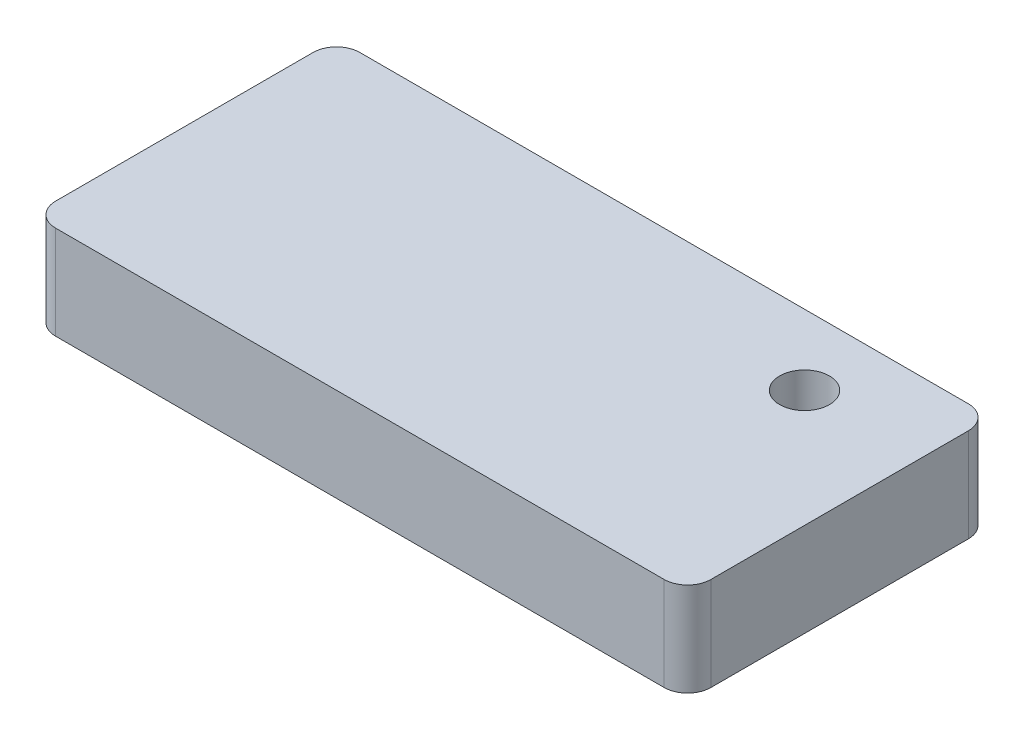
ISO-10303-21;
HEADER;
FILE_DESCRIPTION(('STEP AP214'),'2;1');
FILE_NAME('part.step','',(''),(''),'','','');
FILE_SCHEMA(('AUTOMOTIVE_DESIGN { 1 0 10303 214 1 1 1 1 }'));
ENDSEC;
DATA;
#1=APPLICATION_CONTEXT('core data for automotive mechanical design processes');
#2=APPLICATION_PROTOCOL_DEFINITION('international standard','automotive_design',2000,#1);
#3=PRODUCT_CONTEXT('',#1,'mechanical');
#4=PRODUCT('Part','Part','',(#3));
#5=PRODUCT_RELATED_PRODUCT_CATEGORY('part','',(#4));
#6=PRODUCT_DEFINITION_FORMATION('','',#4);
#7=PRODUCT_DEFINITION_CONTEXT('part definition',#1,'design');
#8=PRODUCT_DEFINITION('design','',#6,#7);
#9=PRODUCT_DEFINITION_SHAPE('','',#8);
#10=(LENGTH_UNIT() NAMED_UNIT(*) SI_UNIT(.MILLI.,.METRE.));
#11=(NAMED_UNIT(*) PLANE_ANGLE_UNIT() SI_UNIT($,.RADIAN.));
#12=(NAMED_UNIT(*) SI_UNIT($,.STERADIAN.) SOLID_ANGLE_UNIT());
#13=UNCERTAINTY_MEASURE_WITH_UNIT(LENGTH_MEASURE(1.E-05),#10,'distance_accuracy_value','');
#14=(GEOMETRIC_REPRESENTATION_CONTEXT(3) GLOBAL_UNCERTAINTY_ASSIGNED_CONTEXT((#13)) GLOBAL_UNIT_ASSIGNED_CONTEXT((#10,
#11,#12)) REPRESENTATION_CONTEXT('',''));
#15=CARTESIAN_POINT('',(0.,0.,0.));
#16=DIRECTION('',(0.,0.,1.));
#17=DIRECTION('',(1.,0.,0.));
#18=AXIS2_PLACEMENT_3D('',#15,#16,#17);
#19=CARTESIAN_POINT('',(0.,12.7,0.));
#20=DIRECTION('',(1.,0.,0.));
#21=DIRECTION('',(0.,0.,-1.));
#22=AXIS2_PLACEMENT_3D('',#19,#20,#21);
#23=PLANE('',#22);
#24=DIRECTION('',(0.,0.,1.));
#25=VECTOR('',#24,1.);
#26=CARTESIAN_POINT('',(0.,12.7,0.));
#27=LINE('',#26,#25);
#28=CARTESIAN_POINT('',(0.,12.7,-38.1));
#29=VERTEX_POINT('',#28);
#30=CARTESIAN_POINT('',(0.,12.7,-3.175));
#31=VERTEX_POINT('',#30);
#32=EDGE_CURVE('E128',#29,#31,#27,.T.);
#33=ORIENTED_EDGE('',*,*,#32,.F.);
#34=DIRECTION('',(0.,-1.,0.));
#35=VECTOR('',#34,1.);
#36=CARTESIAN_POINT('',(0.,12.7,-38.1));
#37=LINE('',#36,#35);
#38=CARTESIAN_POINT('',(0.,0.,-38.1));
#39=VERTEX_POINT('',#38);
#40=EDGE_CURVE('E11',#29,#39,#37,.T.);
#41=ORIENTED_EDGE('',*,*,#40,.T.);
#42=DIRECTION('',(0.,0.,1.));
#43=VECTOR('',#42,1.);
#44=CARTESIAN_POINT('',(0.,0.,0.));
#45=LINE('',#44,#43);
#46=CARTESIAN_POINT('',(0.,0.,-3.175));
#47=VERTEX_POINT('',#46);
#48=EDGE_CURVE('E130',#39,#47,#45,.T.);
#49=ORIENTED_EDGE('',*,*,#48,.T.);
#50=DIRECTION('',(0.,-1.,0.));
#51=VECTOR('',#50,1.);
#52=CARTESIAN_POINT('',(0.,12.7,-3.175));
#53=LINE('',#52,#51);
#54=EDGE_CURVE('E41',#47,#31,#53,.F.);
#55=ORIENTED_EDGE('',*,*,#54,.T.);
#56=EDGE_LOOP('',(#33,#41,#49,#55));
#57=FACE_BOUND('',#56,.T.);
#58=ADVANCED_FACE('F33',(#57),#23,.F.);
#59=CARTESIAN_POINT('',(0.,12.7,0.));
#60=DIRECTION('',(0.,0.,-1.));
#61=DIRECTION('',(-1.,0.,0.));
#62=AXIS2_PLACEMENT_3D('',#59,#60,#61);
#63=PLANE('',#62);
#64=DIRECTION('',(1.,0.,0.));
#65=VECTOR('',#64,1.);
#66=CARTESIAN_POINT('',(0.,0.,0.));
#67=LINE('',#66,#65);
#68=CARTESIAN_POINT('',(3.175,0.,0.));
#69=VERTEX_POINT('',#68);
#70=CARTESIAN_POINT('',(85.725,0.,0.));
#71=VERTEX_POINT('',#70);
#72=EDGE_CURVE('E126',#69,#71,#67,.T.);
#73=ORIENTED_EDGE('',*,*,#72,.T.);
#74=DIRECTION('',(0.,-1.,0.));
#75=VECTOR('',#74,1.);
#76=CARTESIAN_POINT('',(85.725,12.7,0.));
#77=LINE('',#76,#75);
#78=CARTESIAN_POINT('',(85.725,12.7,0.));
#79=VERTEX_POINT('',#78);
#80=EDGE_CURVE('E105',#71,#79,#77,.F.);
#81=ORIENTED_EDGE('',*,*,#80,.T.);
#82=DIRECTION('',(1.,0.,0.));
#83=VECTOR('',#82,1.);
#84=CARTESIAN_POINT('',(0.,12.7,0.));
#85=LINE('',#84,#83);
#86=CARTESIAN_POINT('',(3.175,12.7,0.));
#87=VERTEX_POINT('',#86);
#88=EDGE_CURVE('E166',#87,#79,#85,.T.);
#89=ORIENTED_EDGE('',*,*,#88,.F.);
#90=DIRECTION('',(0.,-1.,0.));
#91=VECTOR('',#90,1.);
#92=CARTESIAN_POINT('',(3.175,12.7,0.));
#93=LINE('',#92,#91);
#94=EDGE_CURVE('E110',#87,#69,#93,.T.);
#95=ORIENTED_EDGE('',*,*,#94,.T.);
#96=EDGE_LOOP('',(#73,#81,#89,#95));
#97=FACE_BOUND('',#96,.T.);
#98=ADVANCED_FACE('F170',(#97),#63,.F.);
#99=CARTESIAN_POINT('',(88.9,12.7,0.));
#100=DIRECTION('',(-1.,0.,0.));
#101=DIRECTION('',(0.,0.,1.));
#102=AXIS2_PLACEMENT_3D('',#99,#100,#101);
#103=PLANE('',#102);
#104=DIRECTION('',(0.,0.,-1.));
#105=VECTOR('',#104,1.);
#106=CARTESIAN_POINT('',(88.9,12.7,0.));
#107=LINE('',#106,#105);
#108=CARTESIAN_POINT('',(88.9,12.7,-3.175));
#109=VERTEX_POINT('',#108);
#110=CARTESIAN_POINT('',(88.9,12.7,-38.1));
#111=VERTEX_POINT('',#110);
#112=EDGE_CURVE('E119',#109,#111,#107,.T.);
#113=ORIENTED_EDGE('',*,*,#112,.F.);
#114=DIRECTION('',(0.,-1.,0.));
#115=VECTOR('',#114,1.);
#116=CARTESIAN_POINT('',(88.9,12.7,-3.175));
#117=LINE('',#116,#115);
#118=CARTESIAN_POINT('',(88.9,0.,-3.175));
#119=VERTEX_POINT('',#118);
#120=EDGE_CURVE('E104',#109,#119,#117,.T.);
#121=ORIENTED_EDGE('',*,*,#120,.T.);
#122=DIRECTION('',(0.,0.,-1.));
#123=VECTOR('',#122,1.);
#124=CARTESIAN_POINT('',(88.9,0.,0.));
#125=LINE('',#124,#123);
#126=CARTESIAN_POINT('',(88.9,0.,-38.1));
#127=VERTEX_POINT('',#126);
#128=EDGE_CURVE('E117',#119,#127,#125,.T.);
#129=ORIENTED_EDGE('',*,*,#128,.T.);
#130=DIRECTION('',(0.,-1.,0.));
#131=VECTOR('',#130,1.);
#132=CARTESIAN_POINT('',(88.9,12.7,-38.1));
#133=LINE('',#132,#131);
#134=EDGE_CURVE('E121',#127,#111,#133,.F.);
#135=ORIENTED_EDGE('',*,*,#134,.T.);
#136=EDGE_LOOP('',(#113,#121,#129,#135));
#137=FACE_BOUND('',#136,.T.);
#138=ADVANCED_FACE('F116',(#137),#103,.F.);
#139=CARTESIAN_POINT('',(0.,12.7,-41.275));
#140=DIRECTION('',(0.,0.,1.));
#141=DIRECTION('',(1.,0.,0.));
#142=AXIS2_PLACEMENT_3D('',#139,#140,#141);
#143=PLANE('',#142);
#144=DIRECTION('',(-1.,0.,0.));
#145=VECTOR('',#144,1.);
#146=CARTESIAN_POINT('',(0.,12.7,-41.275));
#147=LINE('',#146,#145);
#148=CARTESIAN_POINT('',(85.725,12.7,-41.275));
#149=VERTEX_POINT('',#148);
#150=CARTESIAN_POINT('',(3.175,12.7,-41.275));
#151=VERTEX_POINT('',#150);
#152=EDGE_CURVE('E134',#149,#151,#147,.T.);
#153=ORIENTED_EDGE('',*,*,#152,.F.);
#154=DIRECTION('',(0.,-1.,0.));
#155=VECTOR('',#154,1.);
#156=CARTESIAN_POINT('',(85.725,12.7,-41.275));
#157=LINE('',#156,#155);
#158=CARTESIAN_POINT('',(85.725,0.,-41.275));
#159=VERTEX_POINT('',#158);
#160=EDGE_CURVE('E151',#149,#159,#157,.T.);
#161=ORIENTED_EDGE('',*,*,#160,.T.);
#162=DIRECTION('',(-1.,0.,0.));
#163=VECTOR('',#162,1.);
#164=CARTESIAN_POINT('',(0.,0.,-41.275));
#165=LINE('',#164,#163);
#166=CARTESIAN_POINT('',(3.175,0.,-41.275));
#167=VERTEX_POINT('',#166);
#168=EDGE_CURVE('E125',#159,#167,#165,.T.);
#169=ORIENTED_EDGE('',*,*,#168,.T.);
#170=DIRECTION('',(0.,-1.,0.));
#171=VECTOR('',#170,1.);
#172=CARTESIAN_POINT('',(3.175,12.7,-41.275));
#173=LINE('',#172,#171);
#174=EDGE_CURVE('E48',#167,#151,#173,.F.);
#175=ORIENTED_EDGE('',*,*,#174,.T.);
#176=EDGE_LOOP('',(#153,#161,#169,#175));
#177=FACE_BOUND('',#176,.T.);
#178=ADVANCED_FACE('F185',(#177),#143,.F.);
#179=CARTESIAN_POINT('',(0.,12.7,0.));
#180=DIRECTION('',(0.,-1.,0.));
#181=DIRECTION('',(0.,0.,-1.));
#182=AXIS2_PLACEMENT_3D('',#179,#180,#181);
#183=PLANE('',#182);
#184=CARTESIAN_POINT('',(73.025,12.7,-31.75));
#185=DIRECTION('',(0.,1.,0.));
#186=DIRECTION('',(0.,0.,1.));
#187=AXIS2_PLACEMENT_3D('',#184,#185,#186);
#188=CIRCLE('',#187,3.37819999999998);
#189=CARTESIAN_POINT('',(73.025,12.7,-28.3718));
#190=VERTEX_POINT('',#189);
#191=EDGE_CURVE('E173',#190,#190,#188,.T.);
#192=ORIENTED_EDGE('',*,*,#191,.F.);
#193=EDGE_LOOP('',(#192));
#194=FACE_BOUND('',#193,.T.);
#195=ORIENTED_EDGE('',*,*,#88,.T.);
#196=CARTESIAN_POINT('',(85.725,12.7,-3.175));
#197=DIRECTION('',(0.,-1.,0.));
#198=DIRECTION('',(0.,0.,-1.));
#199=AXIS2_PLACEMENT_3D('',#196,#197,#198);
#200=CIRCLE('',#199,3.175);
#201=EDGE_CURVE('E148',#79,#109,#200,.F.);
#202=ORIENTED_EDGE('',*,*,#201,.T.);
#203=ORIENTED_EDGE('',*,*,#112,.T.);
#204=CARTESIAN_POINT('',(85.725,12.7,-38.1));
#205=DIRECTION('',(0.,-1.,0.));
#206=DIRECTION('',(0.,0.,-1.));
#207=AXIS2_PLACEMENT_3D('',#204,#205,#206);
#208=CIRCLE('',#207,3.175);
#209=EDGE_CURVE('E55',#111,#149,#208,.F.);
#210=ORIENTED_EDGE('',*,*,#209,.T.);
#211=ORIENTED_EDGE('',*,*,#152,.T.);
#212=CARTESIAN_POINT('',(3.175,12.7,-38.1));
#213=DIRECTION('',(0.,-1.,0.));
#214=DIRECTION('',(0.,0.,-1.));
#215=AXIS2_PLACEMENT_3D('',#212,#213,#214);
#216=CIRCLE('',#215,3.175);
#217=EDGE_CURVE('E145',#151,#29,#216,.F.);
#218=ORIENTED_EDGE('',*,*,#217,.T.);
#219=ORIENTED_EDGE('',*,*,#32,.T.);
#220=CARTESIAN_POINT('',(3.175,12.7,-3.175));
#221=DIRECTION('',(0.,-1.,0.));
#222=DIRECTION('',(0.,0.,-1.));
#223=AXIS2_PLACEMENT_3D('',#220,#221,#222);
#224=CIRCLE('',#223,3.175);
#225=EDGE_CURVE('E143',#31,#87,#224,.F.);
#226=ORIENTED_EDGE('',*,*,#225,.T.);
#227=EDGE_LOOP('',(#195,#202,#203,#210,#211,#218,#219,#226));
#228=FACE_BOUND('',#227,.T.);
#229=ADVANCED_FACE('F163',(#194,#228),#183,.F.);
#230=CARTESIAN_POINT('',(0.,0.,0.));
#231=DIRECTION('',(0.,-1.,0.));
#232=DIRECTION('',(0.,0.,-1.));
#233=AXIS2_PLACEMENT_3D('',#230,#231,#232);
#234=PLANE('',#233);
#235=CARTESIAN_POINT('',(73.025,0.,-31.75));
#236=DIRECTION('',(0.,1.,0.));
#237=DIRECTION('',(0.,0.,1.));
#238=AXIS2_PLACEMENT_3D('',#235,#236,#237);
#239=CIRCLE('',#238,3.3782);
#240=CARTESIAN_POINT('',(73.025,0.,-28.3718));
#241=VERTEX_POINT('',#240);
#242=EDGE_CURVE('E171',#241,#241,#239,.T.);
#243=ORIENTED_EDGE('',*,*,#242,.T.);
#244=EDGE_LOOP('',(#243));
#245=FACE_BOUND('',#244,.T.);
#246=ORIENTED_EDGE('',*,*,#128,.F.);
#247=CARTESIAN_POINT('',(85.725,0.,-3.175));
#248=DIRECTION('',(0.,-1.,0.));
#249=DIRECTION('',(0.,0.,-1.));
#250=AXIS2_PLACEMENT_3D('',#247,#248,#249);
#251=CIRCLE('',#250,3.175);
#252=EDGE_CURVE('E100',#119,#71,#251,.T.);
#253=ORIENTED_EDGE('',*,*,#252,.T.);
#254=ORIENTED_EDGE('',*,*,#72,.F.);
#255=CARTESIAN_POINT('',(3.175,0.,-3.175));
#256=DIRECTION('',(0.,-1.,0.));
#257=DIRECTION('',(0.,0.,-1.));
#258=AXIS2_PLACEMENT_3D('',#255,#256,#257);
#259=CIRCLE('',#258,3.175);
#260=EDGE_CURVE('E120',#69,#47,#259,.T.);
#261=ORIENTED_EDGE('',*,*,#260,.T.);
#262=ORIENTED_EDGE('',*,*,#48,.F.);
#263=CARTESIAN_POINT('',(3.175,0.,-38.1));
#264=DIRECTION('',(0.,-1.,0.));
#265=DIRECTION('',(0.,0.,-1.));
#266=AXIS2_PLACEMENT_3D('',#263,#264,#265);
#267=CIRCLE('',#266,3.175);
#268=EDGE_CURVE('E137',#39,#167,#267,.T.);
#269=ORIENTED_EDGE('',*,*,#268,.T.);
#270=ORIENTED_EDGE('',*,*,#168,.F.);
#271=CARTESIAN_POINT('',(85.725,0.,-38.1));
#272=DIRECTION('',(0.,-1.,0.));
#273=DIRECTION('',(0.,0.,-1.));
#274=AXIS2_PLACEMENT_3D('',#271,#272,#273);
#275=CIRCLE('',#274,3.175);
#276=EDGE_CURVE('E111',#159,#127,#275,.T.);
#277=ORIENTED_EDGE('',*,*,#276,.T.);
#278=EDGE_LOOP('',(#246,#253,#254,#261,#262,#269,#270,#277));
#279=FACE_BOUND('',#278,.T.);
#280=ADVANCED_FACE('F123',(#245,#279),#234,.T.);
#281=CARTESIAN_POINT('',(73.025,12.7,-31.75));
#282=DIRECTION('',(0.,1.,0.));
#283=DIRECTION('',(0.,0.,1.));
#284=AXIS2_PLACEMENT_3D('',#281,#282,#283);
#285=CYLINDRICAL_SURFACE('',#284,3.37819999999999);
#286=ORIENTED_EDGE('',*,*,#242,.F.);
#287=EDGE_LOOP('',(#286));
#288=FACE_BOUND('',#287,.T.);
#289=ORIENTED_EDGE('',*,*,#191,.T.);
#290=EDGE_LOOP('',(#289));
#291=FACE_BOUND('',#290,.T.);
#292=ADVANCED_FACE('F182',(#288,#291),#285,.F.);
#293=CARTESIAN_POINT('',(85.725,12.7,-3.175));
#294=DIRECTION('',(0.,-1.,0.));
#295=DIRECTION('',(0.,0.,-1.));
#296=AXIS2_PLACEMENT_3D('',#293,#294,#295);
#297=CYLINDRICAL_SURFACE('',#296,3.175);
#298=ORIENTED_EDGE('',*,*,#201,.F.);
#299=ORIENTED_EDGE('',*,*,#80,.F.);
#300=ORIENTED_EDGE('',*,*,#252,.F.);
#301=ORIENTED_EDGE('',*,*,#120,.F.);
#302=EDGE_LOOP('',(#298,#299,#300,#301));
#303=FACE_BOUND('',#302,.T.);
#304=ADVANCED_FACE('F103',(#303),#297,.T.);
#305=CARTESIAN_POINT('',(85.725,12.7,-38.1));
#306=DIRECTION('',(0.,-1.,0.));
#307=DIRECTION('',(0.,0.,-1.));
#308=AXIS2_PLACEMENT_3D('',#305,#306,#307);
#309=CYLINDRICAL_SURFACE('',#308,3.175);
#310=ORIENTED_EDGE('',*,*,#209,.F.);
#311=ORIENTED_EDGE('',*,*,#134,.F.);
#312=ORIENTED_EDGE('',*,*,#276,.F.);
#313=ORIENTED_EDGE('',*,*,#160,.F.);
#314=EDGE_LOOP('',(#310,#311,#312,#313));
#315=FACE_BOUND('',#314,.T.);
#316=ADVANCED_FACE('F206',(#315),#309,.T.);
#317=CARTESIAN_POINT('',(3.175,12.7,-38.1));
#318=DIRECTION('',(0.,-1.,0.));
#319=DIRECTION('',(0.,0.,-1.));
#320=AXIS2_PLACEMENT_3D('',#317,#318,#319);
#321=CYLINDRICAL_SURFACE('',#320,3.175);
#322=ORIENTED_EDGE('',*,*,#217,.F.);
#323=ORIENTED_EDGE('',*,*,#174,.F.);
#324=ORIENTED_EDGE('',*,*,#268,.F.);
#325=ORIENTED_EDGE('',*,*,#40,.F.);
#326=EDGE_LOOP('',(#322,#323,#324,#325));
#327=FACE_BOUND('',#326,.T.);
#328=ADVANCED_FACE('F208',(#327),#321,.T.);
#329=CARTESIAN_POINT('',(3.175,12.7,-3.175));
#330=DIRECTION('',(0.,-1.,0.));
#331=DIRECTION('',(0.,0.,-1.));
#332=AXIS2_PLACEMENT_3D('',#329,#330,#331);
#333=CYLINDRICAL_SURFACE('',#332,3.175);
#334=ORIENTED_EDGE('',*,*,#225,.F.);
#335=ORIENTED_EDGE('',*,*,#54,.F.);
#336=ORIENTED_EDGE('',*,*,#260,.F.);
#337=ORIENTED_EDGE('',*,*,#94,.F.);
#338=EDGE_LOOP('',(#334,#335,#336,#337));
#339=FACE_BOUND('',#338,.T.);
#340=ADVANCED_FACE('F35',(#339),#333,.T.);
#341=CLOSED_SHELL('',(#58,#98,#138,#178,#229,#280,#292,#304,#316,#328,#340));
#342=MANIFOLD_SOLID_BREP('B2',#341);
#343=ADVANCED_BREP_SHAPE_REPRESENTATION('',(#18,#342),#14);
#344=SHAPE_DEFINITION_REPRESENTATION(#9,#343);
ENDSEC;
END-ISO-10303-21;
